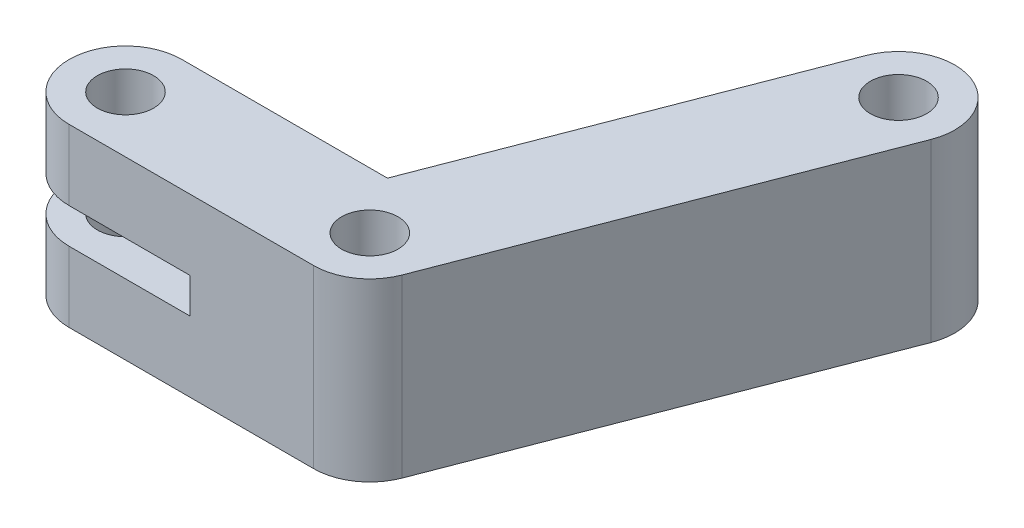
ISO-10303-21;
HEADER;
FILE_DESCRIPTION(('STEP AP214'),'2;1');
FILE_NAME('part.step','',(''),(''),'','','');
FILE_SCHEMA(('AUTOMOTIVE_DESIGN { 1 0 10303 214 1 1 1 1 }'));
ENDSEC;
DATA;
#1=APPLICATION_CONTEXT('core data for automotive mechanical design processes');
#2=APPLICATION_PROTOCOL_DEFINITION('international standard','automotive_design',2000,#1);
#3=PRODUCT_CONTEXT('',#1,'mechanical');
#4=PRODUCT('Part','Part','',(#3));
#5=PRODUCT_RELATED_PRODUCT_CATEGORY('part','',(#4));
#6=PRODUCT_DEFINITION_FORMATION('','',#4);
#7=PRODUCT_DEFINITION_CONTEXT('part definition',#1,'design');
#8=PRODUCT_DEFINITION('design','',#6,#7);
#9=PRODUCT_DEFINITION_SHAPE('','',#8);
#10=(LENGTH_UNIT() NAMED_UNIT(*) SI_UNIT(.MILLI.,.METRE.));
#11=(NAMED_UNIT(*) PLANE_ANGLE_UNIT() SI_UNIT($,.RADIAN.));
#12=(NAMED_UNIT(*) SI_UNIT($,.STERADIAN.) SOLID_ANGLE_UNIT());
#13=UNCERTAINTY_MEASURE_WITH_UNIT(LENGTH_MEASURE(1.E-05),#10,'distance_accuracy_value','');
#14=(GEOMETRIC_REPRESENTATION_CONTEXT(3) GLOBAL_UNCERTAINTY_ASSIGNED_CONTEXT((#13)) GLOBAL_UNIT_ASSIGNED_CONTEXT((#10,
#11,#12)) REPRESENTATION_CONTEXT('',''));
#15=CARTESIAN_POINT('',(0.,0.,0.));
#16=DIRECTION('',(0.,0.,1.));
#17=DIRECTION('',(1.,0.,0.));
#18=AXIS2_PLACEMENT_3D('',#15,#16,#17);
#19=CARTESIAN_POINT('',(0.,12.5,0.));
#20=DIRECTION('',(0.,-1.,0.));
#21=DIRECTION('',(0.,0.,-1.));
#22=AXIS2_PLACEMENT_3D('',#19,#20,#21);
#23=CYLINDRICAL_SURFACE('',#22,8.);
#24=DIRECTION('',(0.,-1.,0.));
#25=VECTOR('',#24,1.);
#26=CARTESIAN_POINT('',(0.,12.5,-8.));
#27=LINE('',#26,#25);
#28=CARTESIAN_POINT('',(0.,12.5,-8.));
#29=VERTEX_POINT('',#28);
#30=CARTESIAN_POINT('',(0.,2.5,-8.));
#31=VERTEX_POINT('',#30);
#32=EDGE_CURVE('E155',#29,#31,#27,.T.);
#33=ORIENTED_EDGE('',*,*,#32,.T.);
#34=CARTESIAN_POINT('',(0.,2.5,0.));
#35=DIRECTION('',(0.,1.,0.));
#36=DIRECTION('',(0.,0.,1.));
#37=AXIS2_PLACEMENT_3D('',#34,#35,#36);
#38=CIRCLE('',#37,8.);
#39=CARTESIAN_POINT('',(0.,2.5,8.));
#40=VERTEX_POINT('',#39);
#41=EDGE_CURVE('E203',#40,#31,#38,.F.);
#42=ORIENTED_EDGE('',*,*,#41,.F.);
#43=DIRECTION('',(0.,-1.,0.));
#44=VECTOR('',#43,1.);
#45=CARTESIAN_POINT('',(0.,12.5,8.));
#46=LINE('',#45,#44);
#47=CARTESIAN_POINT('',(0.,12.5,8.));
#48=VERTEX_POINT('',#47);
#49=EDGE_CURVE('E11',#48,#40,#46,.T.);
#50=ORIENTED_EDGE('',*,*,#49,.F.);
#51=CARTESIAN_POINT('',(0.,12.5,0.));
#52=DIRECTION('',(0.,1.,0.));
#53=DIRECTION('',(0.,0.,-1.));
#54=AXIS2_PLACEMENT_3D('',#51,#52,#53);
#55=CIRCLE('',#54,8.);
#56=EDGE_CURVE('E154',#29,#48,#55,.T.);
#57=ORIENTED_EDGE('',*,*,#56,.F.);
#58=EDGE_LOOP('',(#33,#42,#50,#57));
#59=FACE_BOUND('',#58,.T.);
#60=ADVANCED_FACE('F36',(#59),#23,.T.);
#61=CARTESIAN_POINT('',(0.,12.5,0.));
#62=DIRECTION('',(0.,-1.,0.));
#63=DIRECTION('',(0.,0.,-1.));
#64=AXIS2_PLACEMENT_3D('',#61,#62,#63);
#65=CYLINDRICAL_SURFACE('',#64,4.);
#66=CARTESIAN_POINT('',(0.,2.5,0.));
#67=DIRECTION('',(0.,1.,0.));
#68=DIRECTION('',(0.,0.,1.));
#69=AXIS2_PLACEMENT_3D('',#66,#67,#68);
#70=CIRCLE('',#69,4.);
#71=CARTESIAN_POINT('',(0.,2.5,4.));
#72=VERTEX_POINT('',#71);
#73=EDGE_CURVE('E216',#72,#72,#70,.F.);
#74=ORIENTED_EDGE('',*,*,#73,.T.);
#75=EDGE_LOOP('',(#74));
#76=FACE_BOUND('',#75,.T.);
#77=CARTESIAN_POINT('',(0.,12.5,0.));
#78=DIRECTION('',(0.,1.,0.));
#79=DIRECTION('',(0.,0.,1.));
#80=AXIS2_PLACEMENT_3D('',#77,#78,#79);
#81=CIRCLE('',#80,4.);
#82=CARTESIAN_POINT('',(0.,12.5,4.));
#83=VERTEX_POINT('',#82);
#84=EDGE_CURVE('E143',#83,#83,#81,.T.);
#85=ORIENTED_EDGE('',*,*,#84,.T.);
#86=EDGE_LOOP('',(#85));
#87=FACE_BOUND('',#86,.T.);
#88=ADVANCED_FACE('F190',(#76,#87),#65,.F.);
#89=CARTESIAN_POINT('',(0.,12.5,0.));
#90=DIRECTION('',(0.,-1.,0.));
#91=DIRECTION('',(0.,0.,-1.));
#92=AXIS2_PLACEMENT_3D('',#89,#90,#91);
#93=PLANE('',#92);
#94=ORIENTED_EDGE('',*,*,#56,.T.);
#95=DIRECTION('',(1.,0.,0.));
#96=VECTOR('',#95,1.);
#97=CARTESIAN_POINT('',(34.72,12.5,7.99999999999999));
#98=LINE('',#97,#96);
#99=CARTESIAN_POINT('',(34.72,12.5,7.99999999999999));
#100=VERTEX_POINT('',#99);
#101=EDGE_CURVE('E99',#48,#100,#98,.T.);
#102=ORIENTED_EDGE('',*,*,#101,.T.);
#103=CARTESIAN_POINT('',(34.72,12.5,0.));
#104=DIRECTION('',(0.,1.,0.));
#105=DIRECTION('',(0.,0.,-1.));
#106=AXIS2_PLACEMENT_3D('',#103,#104,#105);
#107=CIRCLE('',#106,8.);
#108=CARTESIAN_POINT('',(42.1854515483824,12.5,2.87524489022319));
#109=VERTEX_POINT('',#108);
#110=EDGE_CURVE('E254',#100,#109,#107,.T.);
#111=ORIENTED_EDGE('',*,*,#110,.T.);
#112=DIRECTION('',(0.359405611277904,0.,-0.9331814435478));
#113=VECTOR('',#112,1.);
#114=CARTESIAN_POINT('',(63.0754515483824,12.5,-51.3647551097768));
#115=LINE('',#114,#113);
#116=CARTESIAN_POINT('',(63.0754515483824,12.5,-51.3647551097768));
#117=VERTEX_POINT('',#116);
#118=EDGE_CURVE('E119',#109,#117,#115,.T.);
#119=ORIENTED_EDGE('',*,*,#118,.T.);
#120=CARTESIAN_POINT('',(55.61,12.5,-54.24));
#121=DIRECTION('',(0.,1.,0.));
#122=DIRECTION('',(0.,0.,-1.));
#123=AXIS2_PLACEMENT_3D('',#120,#121,#122);
#124=CIRCLE('',#123,8.00000000000001);
#125=CARTESIAN_POINT('',(48.1445484516176,12.5,-57.1152448902232));
#126=VERTEX_POINT('',#125);
#127=EDGE_CURVE('E111',#117,#126,#124,.T.);
#128=ORIENTED_EDGE('',*,*,#127,.T.);
#129=DIRECTION('',(-0.359405611277904,0.,0.9331814435478));
#130=VECTOR('',#129,1.);
#131=CARTESIAN_POINT('',(29.2282972392879,12.5,-8.));
#132=LINE('',#131,#130);
#133=CARTESIAN_POINT('',(29.2282972392879,12.5,-8.));
#134=VERTEX_POINT('',#133);
#135=EDGE_CURVE('E116',#126,#134,#132,.T.);
#136=ORIENTED_EDGE('',*,*,#135,.T.);
#137=DIRECTION('',(-1.,0.,0.));
#138=VECTOR('',#137,1.);
#139=CARTESIAN_POINT('',(0.,12.5,-8.));
#140=LINE('',#139,#138);
#141=EDGE_CURVE('E60',#134,#29,#140,.T.);
#142=ORIENTED_EDGE('',*,*,#141,.T.);
#143=EDGE_LOOP('',(#94,#102,#111,#119,#128,#136,#142));
#144=FACE_BOUND('',#143,.T.);
#145=ORIENTED_EDGE('',*,*,#84,.F.);
#146=EDGE_LOOP('',(#145));
#147=FACE_BOUND('',#146,.T.);
#148=CARTESIAN_POINT('',(34.72,12.5,0.));
#149=DIRECTION('',(0.,1.,0.));
#150=DIRECTION('',(0.,0.,1.));
#151=AXIS2_PLACEMENT_3D('',#148,#149,#150);
#152=CIRCLE('',#151,4.);
#153=CARTESIAN_POINT('',(34.72,12.5,4.));
#154=VERTEX_POINT('',#153);
#155=EDGE_CURVE('E242',#154,#154,#152,.T.);
#156=ORIENTED_EDGE('',*,*,#155,.F.);
#157=EDGE_LOOP('',(#156));
#158=FACE_BOUND('',#157,.T.);
#159=CARTESIAN_POINT('',(55.61,12.5,-54.24));
#160=DIRECTION('',(0.,1.,0.));
#161=DIRECTION('',(0.,0.,1.));
#162=AXIS2_PLACEMENT_3D('',#159,#160,#161);
#163=CIRCLE('',#162,4.00000000000001);
#164=CARTESIAN_POINT('',(55.61,12.5,-50.24));
#165=VERTEX_POINT('',#164);
#166=EDGE_CURVE('E236',#165,#165,#163,.T.);
#167=ORIENTED_EDGE('',*,*,#166,.F.);
#168=EDGE_LOOP('',(#167));
#169=FACE_BOUND('',#168,.T.);
#170=ADVANCED_FACE('F113',(#144,#147,#158,#169),#93,.F.);
#171=CARTESIAN_POINT('',(0.,-12.5,0.));
#172=DIRECTION('',(0.,-1.,0.));
#173=DIRECTION('',(0.,0.,-1.));
#174=AXIS2_PLACEMENT_3D('',#171,#172,#173);
#175=PLANE('',#174);
#176=CARTESIAN_POINT('',(34.72,-12.5,0.));
#177=DIRECTION('',(0.,1.,0.));
#178=DIRECTION('',(0.,0.,1.));
#179=AXIS2_PLACEMENT_3D('',#176,#177,#178);
#180=CIRCLE('',#179,4.);
#181=CARTESIAN_POINT('',(34.72,-12.5,4.));
#182=VERTEX_POINT('',#181);
#183=EDGE_CURVE('E239',#182,#182,#180,.T.);
#184=ORIENTED_EDGE('',*,*,#183,.T.);
#185=EDGE_LOOP('',(#184));
#186=FACE_BOUND('',#185,.T.);
#187=CARTESIAN_POINT('',(0.,-12.5,0.));
#188=DIRECTION('',(0.,1.,0.));
#189=DIRECTION('',(0.,0.,-1.));
#190=AXIS2_PLACEMENT_3D('',#187,#188,#189);
#191=CIRCLE('',#190,8.);
#192=CARTESIAN_POINT('',(0.,-12.5,-8.));
#193=VERTEX_POINT('',#192);
#194=CARTESIAN_POINT('',(0.,-12.5,8.));
#195=VERTEX_POINT('',#194);
#196=EDGE_CURVE('E140',#193,#195,#191,.T.);
#197=ORIENTED_EDGE('',*,*,#196,.F.);
#198=DIRECTION('',(-1.,0.,0.));
#199=VECTOR('',#198,1.);
#200=CARTESIAN_POINT('',(0.,-12.5,-8.));
#201=LINE('',#200,#199);
#202=CARTESIAN_POINT('',(29.2282972392879,-12.5,-8.));
#203=VERTEX_POINT('',#202);
#204=EDGE_CURVE('E152',#203,#193,#201,.T.);
#205=ORIENTED_EDGE('',*,*,#204,.F.);
#206=DIRECTION('',(-0.359405611277904,0.,0.9331814435478));
#207=VECTOR('',#206,1.);
#208=CARTESIAN_POINT('',(29.2282972392879,-12.5,-8.));
#209=LINE('',#208,#207);
#210=CARTESIAN_POINT('',(48.1445484516176,-12.5,-57.1152448902232));
#211=VERTEX_POINT('',#210);
#212=EDGE_CURVE('E150',#211,#203,#209,.T.);
#213=ORIENTED_EDGE('',*,*,#212,.F.);
#214=CARTESIAN_POINT('',(55.61,-12.5,-54.24));
#215=DIRECTION('',(0.,1.,0.));
#216=DIRECTION('',(0.,0.,-1.));
#217=AXIS2_PLACEMENT_3D('',#214,#215,#216);
#218=CIRCLE('',#217,8.00000000000001);
#219=CARTESIAN_POINT('',(63.0754515483824,-12.5,-51.3647551097768));
#220=VERTEX_POINT('',#219);
#221=EDGE_CURVE('E128',#220,#211,#218,.T.);
#222=ORIENTED_EDGE('',*,*,#221,.F.);
#223=DIRECTION('',(0.359405611277904,0.,-0.9331814435478));
#224=VECTOR('',#223,1.);
#225=CARTESIAN_POINT('',(63.0754515483824,-12.5,-51.3647551097768));
#226=LINE('',#225,#224);
#227=CARTESIAN_POINT('',(42.1854515483824,-12.5,2.87524489022319));
#228=VERTEX_POINT('',#227);
#229=EDGE_CURVE('E147',#228,#220,#226,.T.);
#230=ORIENTED_EDGE('',*,*,#229,.F.);
#231=CARTESIAN_POINT('',(34.72,-12.5,0.));
#232=DIRECTION('',(0.,1.,0.));
#233=DIRECTION('',(0.,0.,-1.));
#234=AXIS2_PLACEMENT_3D('',#231,#232,#233);
#235=CIRCLE('',#234,8.);
#236=CARTESIAN_POINT('',(34.72,-12.5,7.99999999999999));
#237=VERTEX_POINT('',#236);
#238=EDGE_CURVE('E145',#237,#228,#235,.T.);
#239=ORIENTED_EDGE('',*,*,#238,.F.);
#240=DIRECTION('',(1.,0.,0.));
#241=VECTOR('',#240,1.);
#242=CARTESIAN_POINT('',(34.72,-12.5,7.99999999999999));
#243=LINE('',#242,#241);
#244=EDGE_CURVE('E142',#195,#237,#243,.T.);
#245=ORIENTED_EDGE('',*,*,#244,.F.);
#246=EDGE_LOOP('',(#197,#205,#213,#222,#230,#239,#245));
#247=FACE_BOUND('',#246,.T.);
#248=CARTESIAN_POINT('',(0.,-12.5,0.));
#249=DIRECTION('',(0.,1.,0.));
#250=DIRECTION('',(0.,0.,1.));
#251=AXIS2_PLACEMENT_3D('',#248,#249,#250);
#252=CIRCLE('',#251,4.);
#253=CARTESIAN_POINT('',(0.,-12.5,4.));
#254=VERTEX_POINT('',#253);
#255=EDGE_CURVE('E245',#254,#254,#252,.T.);
#256=ORIENTED_EDGE('',*,*,#255,.T.);
#257=EDGE_LOOP('',(#256));
#258=FACE_BOUND('',#257,.T.);
#259=CARTESIAN_POINT('',(55.61,-12.5,-54.24));
#260=DIRECTION('',(0.,1.,0.));
#261=DIRECTION('',(0.,0.,1.));
#262=AXIS2_PLACEMENT_3D('',#259,#260,#261);
#263=CIRCLE('',#262,4.00000000000001);
#264=CARTESIAN_POINT('',(55.61,-12.5,-50.24));
#265=VERTEX_POINT('',#264);
#266=EDGE_CURVE('E235',#265,#265,#263,.T.);
#267=ORIENTED_EDGE('',*,*,#266,.T.);
#268=EDGE_LOOP('',(#267));
#269=FACE_BOUND('',#268,.T.);
#270=ADVANCED_FACE('F177',(#186,#247,#258,#269),#175,.T.);
#271=CARTESIAN_POINT('',(0.,-2.5,8.));
#272=VERTEX_POINT('',#271);
#273=EDGE_CURVE('E44',#272,#195,#46,.T.);
#274=ORIENTED_EDGE('',*,*,#273,.F.);
#275=CARTESIAN_POINT('',(0.,-2.5,0.));
#276=DIRECTION('',(0.,-1.,0.));
#277=DIRECTION('',(0.,0.,-1.));
#278=AXIS2_PLACEMENT_3D('',#275,#276,#277);
#279=CIRCLE('',#278,8.);
#280=CARTESIAN_POINT('',(0.,-2.5,-8.));
#281=VERTEX_POINT('',#280);
#282=EDGE_CURVE('E272',#281,#272,#279,.F.);
#283=ORIENTED_EDGE('',*,*,#282,.F.);
#284=EDGE_CURVE('E91',#281,#193,#27,.T.);
#285=ORIENTED_EDGE('',*,*,#284,.T.);
#286=ORIENTED_EDGE('',*,*,#196,.T.);
#287=EDGE_LOOP('',(#274,#283,#285,#286));
#288=FACE_BOUND('',#287,.T.);
#289=ADVANCED_FACE('F38',(#288),#23,.T.);
#290=CARTESIAN_POINT('',(34.72,12.5,7.99999999999999));
#291=DIRECTION('',(0.,0.,-1.));
#292=DIRECTION('',(-1.,0.,0.));
#293=AXIS2_PLACEMENT_3D('',#290,#291,#292);
#294=PLANE('',#293);
#295=ORIENTED_EDGE('',*,*,#49,.T.);
#296=DIRECTION('',(-1.,0.,0.));
#297=VECTOR('',#296,1.);
#298=CARTESIAN_POINT('',(-8.,2.5,8.));
#299=LINE('',#298,#297);
#300=CARTESIAN_POINT('',(17.15,2.5,8.));
#301=VERTEX_POINT('',#300);
#302=EDGE_CURVE('E222',#301,#40,#299,.T.);
#303=ORIENTED_EDGE('',*,*,#302,.F.);
#304=DIRECTION('',(0.,1.,0.));
#305=VECTOR('',#304,1.);
#306=CARTESIAN_POINT('',(17.15,2.5,8.));
#307=LINE('',#306,#305);
#308=CARTESIAN_POINT('',(17.15,-2.5,8.));
#309=VERTEX_POINT('',#308);
#310=EDGE_CURVE('E214',#309,#301,#307,.T.);
#311=ORIENTED_EDGE('',*,*,#310,.F.);
#312=DIRECTION('',(1.,0.,0.));
#313=VECTOR('',#312,1.);
#314=CARTESIAN_POINT('',(-8.,-2.5,8.));
#315=LINE('',#314,#313);
#316=EDGE_CURVE('E174',#272,#309,#315,.T.);
#317=ORIENTED_EDGE('',*,*,#316,.F.);
#318=ORIENTED_EDGE('',*,*,#273,.T.);
#319=ORIENTED_EDGE('',*,*,#244,.T.);
#320=DIRECTION('',(0.,-1.,0.));
#321=VECTOR('',#320,1.);
#322=CARTESIAN_POINT('',(34.72,12.5,7.99999999999999));
#323=LINE('',#322,#321);
#324=EDGE_CURVE('E162',#100,#237,#323,.T.);
#325=ORIENTED_EDGE('',*,*,#324,.F.);
#326=ORIENTED_EDGE('',*,*,#101,.F.);
#327=EDGE_LOOP('',(#295,#303,#311,#317,#318,#319,#325,#326));
#328=FACE_BOUND('',#327,.T.);
#329=ADVANCED_FACE('F170',(#328),#294,.F.);
#330=CARTESIAN_POINT('',(34.72,12.5,0.));
#331=DIRECTION('',(0.,-1.,0.));
#332=DIRECTION('',(0.,0.,-1.));
#333=AXIS2_PLACEMENT_3D('',#330,#331,#332);
#334=CYLINDRICAL_SURFACE('',#333,8.);
#335=ORIENTED_EDGE('',*,*,#238,.T.);
#336=DIRECTION('',(0.,-1.,0.));
#337=VECTOR('',#336,1.);
#338=CARTESIAN_POINT('',(42.1854515483824,12.5,2.87524489022319));
#339=LINE('',#338,#337);
#340=EDGE_CURVE('E160',#109,#228,#339,.T.);
#341=ORIENTED_EDGE('',*,*,#340,.F.);
#342=ORIENTED_EDGE('',*,*,#110,.F.);
#343=ORIENTED_EDGE('',*,*,#324,.T.);
#344=EDGE_LOOP('',(#335,#341,#342,#343));
#345=FACE_BOUND('',#344,.T.);
#346=ADVANCED_FACE('F186',(#345),#334,.T.);
#347=CARTESIAN_POINT('',(63.0754515483824,12.5,-51.3647551097768));
#348=DIRECTION('',(-0.9331814435478,0.,-0.359405611277904));
#349=DIRECTION('',(-0.359405611277904,0.,0.9331814435478));
#350=AXIS2_PLACEMENT_3D('',#347,#348,#349);
#351=PLANE('',#350);
#352=ORIENTED_EDGE('',*,*,#229,.T.);
#353=DIRECTION('',(0.,-1.,0.));
#354=VECTOR('',#353,1.);
#355=CARTESIAN_POINT('',(63.0754515483824,12.5,-51.3647551097768));
#356=LINE('',#355,#354);
#357=EDGE_CURVE('E131',#117,#220,#356,.T.);
#358=ORIENTED_EDGE('',*,*,#357,.F.);
#359=ORIENTED_EDGE('',*,*,#118,.F.);
#360=ORIENTED_EDGE('',*,*,#340,.T.);
#361=EDGE_LOOP('',(#352,#358,#359,#360));
#362=FACE_BOUND('',#361,.T.);
#363=ADVANCED_FACE('F257',(#362),#351,.F.);
#364=CARTESIAN_POINT('',(55.61,12.5,-54.24));
#365=DIRECTION('',(0.,-1.,0.));
#366=DIRECTION('',(0.,0.,-1.));
#367=AXIS2_PLACEMENT_3D('',#364,#365,#366);
#368=CYLINDRICAL_SURFACE('',#367,8.00000000000001);
#369=ORIENTED_EDGE('',*,*,#221,.T.);
#370=DIRECTION('',(0.,-1.,0.));
#371=VECTOR('',#370,1.);
#372=CARTESIAN_POINT('',(48.1445484516176,12.5,-57.1152448902232));
#373=LINE('',#372,#371);
#374=EDGE_CURVE('E125',#126,#211,#373,.T.);
#375=ORIENTED_EDGE('',*,*,#374,.F.);
#376=ORIENTED_EDGE('',*,*,#127,.F.);
#377=ORIENTED_EDGE('',*,*,#357,.T.);
#378=EDGE_LOOP('',(#369,#375,#376,#377));
#379=FACE_BOUND('',#378,.T.);
#380=ADVANCED_FACE('F126',(#379),#368,.T.);
#381=CARTESIAN_POINT('',(29.2282972392879,12.5,-8.));
#382=DIRECTION('',(0.9331814435478,0.,0.359405611277904));
#383=DIRECTION('',(0.359405611277904,0.,-0.9331814435478));
#384=AXIS2_PLACEMENT_3D('',#381,#382,#383);
#385=PLANE('',#384);
#386=ORIENTED_EDGE('',*,*,#212,.T.);
#387=DIRECTION('',(0.,-1.,0.));
#388=VECTOR('',#387,1.);
#389=CARTESIAN_POINT('',(29.2282972392879,12.5,-8.));
#390=LINE('',#389,#388);
#391=EDGE_CURVE('E132',#134,#203,#390,.T.);
#392=ORIENTED_EDGE('',*,*,#391,.F.);
#393=ORIENTED_EDGE('',*,*,#135,.F.);
#394=ORIENTED_EDGE('',*,*,#374,.T.);
#395=EDGE_LOOP('',(#386,#392,#393,#394));
#396=FACE_BOUND('',#395,.T.);
#397=ADVANCED_FACE('F134',(#396),#385,.F.);
#398=CARTESIAN_POINT('',(0.,12.5,-8.));
#399=DIRECTION('',(0.,0.,1.));
#400=DIRECTION('',(1.,0.,0.));
#401=AXIS2_PLACEMENT_3D('',#398,#399,#400);
#402=PLANE('',#401);
#403=DIRECTION('',(0.,-1.,0.));
#404=VECTOR('',#403,1.);
#405=CARTESIAN_POINT('',(17.15,2.5,-8.));
#406=LINE('',#405,#404);
#407=CARTESIAN_POINT('',(17.15,2.5,-8.));
#408=VERTEX_POINT('',#407);
#409=CARTESIAN_POINT('',(17.15,-2.5,-8.));
#410=VERTEX_POINT('',#409);
#411=EDGE_CURVE('E51',#408,#410,#406,.T.);
#412=ORIENTED_EDGE('',*,*,#411,.F.);
#413=DIRECTION('',(1.,0.,0.));
#414=VECTOR('',#413,1.);
#415=CARTESIAN_POINT('',(-8.,2.5,-8.));
#416=LINE('',#415,#414);
#417=EDGE_CURVE('E209',#31,#408,#416,.T.);
#418=ORIENTED_EDGE('',*,*,#417,.F.);
#419=ORIENTED_EDGE('',*,*,#32,.F.);
#420=ORIENTED_EDGE('',*,*,#141,.F.);
#421=ORIENTED_EDGE('',*,*,#391,.T.);
#422=ORIENTED_EDGE('',*,*,#204,.T.);
#423=ORIENTED_EDGE('',*,*,#284,.F.);
#424=DIRECTION('',(-1.,0.,0.));
#425=VECTOR('',#424,1.);
#426=CARTESIAN_POINT('',(-8.,-2.5,-8.));
#427=LINE('',#426,#425);
#428=EDGE_CURVE('E228',#410,#281,#427,.T.);
#429=ORIENTED_EDGE('',*,*,#428,.F.);
#430=EDGE_LOOP('',(#412,#418,#419,#420,#421,#422,#423,#429));
#431=FACE_BOUND('',#430,.T.);
#432=ADVANCED_FACE('F207',(#431),#402,.F.);
#433=CARTESIAN_POINT('',(0.,-2.5,0.));
#434=DIRECTION('',(0.,-1.,0.));
#435=DIRECTION('',(0.,0.,-1.));
#436=AXIS2_PLACEMENT_3D('',#433,#434,#435);
#437=CIRCLE('',#436,4.);
#438=CARTESIAN_POINT('',(0.,-2.5,-4.));
#439=VERTEX_POINT('',#438);
#440=EDGE_CURVE('E230',#439,#439,#437,.F.);
#441=ORIENTED_EDGE('',*,*,#440,.T.);
#442=EDGE_LOOP('',(#441));
#443=FACE_BOUND('',#442,.T.);
#444=ORIENTED_EDGE('',*,*,#255,.F.);
#445=EDGE_LOOP('',(#444));
#446=FACE_BOUND('',#445,.T.);
#447=ADVANCED_FACE('F197',(#443,#446),#65,.F.);
#448=CARTESIAN_POINT('',(34.72,12.5,0.));
#449=DIRECTION('',(0.,-1.,0.));
#450=DIRECTION('',(0.,0.,-1.));
#451=AXIS2_PLACEMENT_3D('',#448,#449,#450);
#452=CYLINDRICAL_SURFACE('',#451,4.);
#453=ORIENTED_EDGE('',*,*,#155,.T.);
#454=EDGE_LOOP('',(#453));
#455=FACE_BOUND('',#454,.T.);
#456=ORIENTED_EDGE('',*,*,#183,.F.);
#457=EDGE_LOOP('',(#456));
#458=FACE_BOUND('',#457,.T.);
#459=ADVANCED_FACE('F287',(#455,#458),#452,.F.);
#460=CARTESIAN_POINT('',(55.61,12.5,-54.24));
#461=DIRECTION('',(0.,-1.,0.));
#462=DIRECTION('',(0.,0.,-1.));
#463=AXIS2_PLACEMENT_3D('',#460,#461,#462);
#464=CYLINDRICAL_SURFACE('',#463,4.00000000000001);
#465=ORIENTED_EDGE('',*,*,#166,.T.);
#466=EDGE_LOOP('',(#465));
#467=FACE_BOUND('',#466,.T.);
#468=ORIENTED_EDGE('',*,*,#266,.F.);
#469=EDGE_LOOP('',(#468));
#470=FACE_BOUND('',#469,.T.);
#471=ADVANCED_FACE('F280',(#467,#470),#464,.F.);
#472=CARTESIAN_POINT('',(-8.,2.5,-62.241));
#473=DIRECTION('',(0.,1.,0.));
#474=DIRECTION('',(0.,0.,1.));
#475=AXIS2_PLACEMENT_3D('',#472,#473,#474);
#476=PLANE('',#475);
#477=ORIENTED_EDGE('',*,*,#73,.F.);
#478=EDGE_LOOP('',(#477));
#479=FACE_BOUND('',#478,.T.);
#480=ORIENTED_EDGE('',*,*,#41,.T.);
#481=ORIENTED_EDGE('',*,*,#417,.T.);
#482=DIRECTION('',(0.,0.,1.));
#483=VECTOR('',#482,1.);
#484=CARTESIAN_POINT('',(17.15,2.5,-62.241));
#485=LINE('',#484,#483);
#486=EDGE_CURVE('E226',#408,#301,#485,.T.);
#487=ORIENTED_EDGE('',*,*,#486,.T.);
#488=ORIENTED_EDGE('',*,*,#302,.T.);
#489=EDGE_LOOP('',(#480,#481,#487,#488));
#490=FACE_BOUND('',#489,.T.);
#491=ADVANCED_FACE('F269',(#479,#490),#476,.F.);
#492=CARTESIAN_POINT('',(17.15,2.5,-62.241));
#493=DIRECTION('',(1.,0.,0.));
#494=DIRECTION('',(0.,0.,-1.));
#495=AXIS2_PLACEMENT_3D('',#492,#493,#494);
#496=PLANE('',#495);
#497=ORIENTED_EDGE('',*,*,#411,.T.);
#498=DIRECTION('',(0.,0.,1.));
#499=VECTOR('',#498,1.);
#500=CARTESIAN_POINT('',(17.15,-2.5,-62.241));
#501=LINE('',#500,#499);
#502=EDGE_CURVE('E225',#410,#309,#501,.T.);
#503=ORIENTED_EDGE('',*,*,#502,.T.);
#504=ORIENTED_EDGE('',*,*,#310,.T.);
#505=ORIENTED_EDGE('',*,*,#486,.F.);
#506=EDGE_LOOP('',(#497,#503,#504,#505));
#507=FACE_BOUND('',#506,.T.);
#508=ADVANCED_FACE('F270',(#507),#496,.F.);
#509=CARTESIAN_POINT('',(-8.,-2.5,-62.241));
#510=DIRECTION('',(0.,-1.,0.));
#511=DIRECTION('',(0.,0.,-1.));
#512=AXIS2_PLACEMENT_3D('',#509,#510,#511);
#513=PLANE('',#512);
#514=ORIENTED_EDGE('',*,*,#440,.F.);
#515=EDGE_LOOP('',(#514));
#516=FACE_BOUND('',#515,.T.);
#517=ORIENTED_EDGE('',*,*,#282,.T.);
#518=ORIENTED_EDGE('',*,*,#316,.T.);
#519=ORIENTED_EDGE('',*,*,#502,.F.);
#520=ORIENTED_EDGE('',*,*,#428,.T.);
#521=EDGE_LOOP('',(#517,#518,#519,#520));
#522=FACE_BOUND('',#521,.T.);
#523=ADVANCED_FACE('F271',(#516,#522),#513,.F.);
#524=CLOSED_SHELL('',(#60,#88,#170,#270,#289,#329,#346,#363,#380,#397,#432,#447,#459,#471,#491,
#508,#523));
#525=MANIFOLD_SOLID_BREP('B2',#524);
#526=ADVANCED_BREP_SHAPE_REPRESENTATION('',(#18,#525),#14);
#527=SHAPE_DEFINITION_REPRESENTATION(#9,#526);
ENDSEC;
END-ISO-10303-21;
